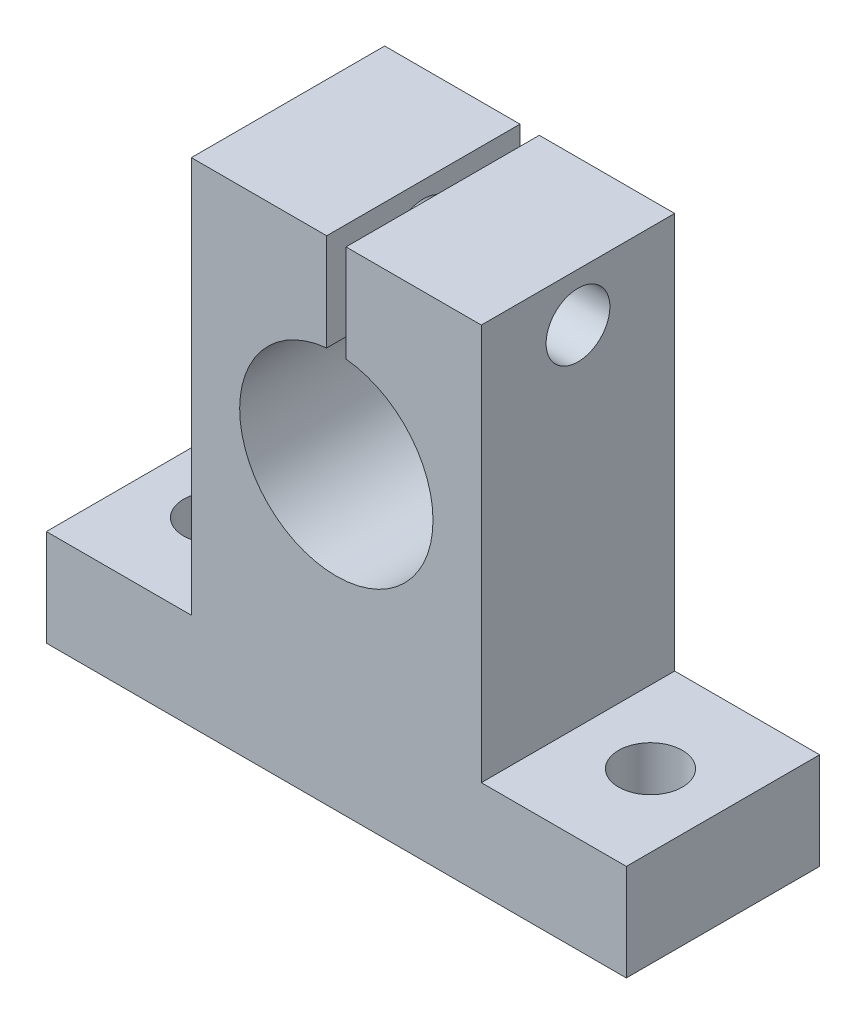
ISO-10303-21;
HEADER;
FILE_DESCRIPTION(('STEP AP214'),'2;1');
FILE_NAME('part.step','',(''),(''),'','','');
FILE_SCHEMA(('AUTOMOTIVE_DESIGN { 1 0 10303 214 1 1 1 1 }'));
ENDSEC;
DATA;
#1=APPLICATION_CONTEXT('core data for automotive mechanical design processes');
#2=APPLICATION_PROTOCOL_DEFINITION('international standard','automotive_design',2000,#1);
#3=PRODUCT_CONTEXT('',#1,'mechanical');
#4=PRODUCT('Part','Part','',(#3));
#5=PRODUCT_RELATED_PRODUCT_CATEGORY('part','',(#4));
#6=PRODUCT_DEFINITION_FORMATION('','',#4);
#7=PRODUCT_DEFINITION_CONTEXT('part definition',#1,'design');
#8=PRODUCT_DEFINITION('design','',#6,#7);
#9=PRODUCT_DEFINITION_SHAPE('','',#8);
#10=(LENGTH_UNIT() NAMED_UNIT(*) SI_UNIT(.MILLI.,.METRE.));
#11=(NAMED_UNIT(*) PLANE_ANGLE_UNIT() SI_UNIT($,.RADIAN.));
#12=(NAMED_UNIT(*) SI_UNIT($,.STERADIAN.) SOLID_ANGLE_UNIT());
#13=UNCERTAINTY_MEASURE_WITH_UNIT(LENGTH_MEASURE(1.E-05),#10,'distance_accuracy_value','');
#14=(GEOMETRIC_REPRESENTATION_CONTEXT(3) GLOBAL_UNCERTAINTY_ASSIGNED_CONTEXT((#13)) GLOBAL_UNIT_ASSIGNED_CONTEXT((#10,
#11,#12)) REPRESENTATION_CONTEXT('',''));
#15=CARTESIAN_POINT('',(0.,0.,0.));
#16=DIRECTION('',(0.,0.,1.));
#17=DIRECTION('',(1.,0.,0.));
#18=AXIS2_PLACEMENT_3D('',#15,#16,#17);
#19=CARTESIAN_POINT('',(15.,51.,10.));
#20=DIRECTION('',(0.,-1.,0.));
#21=DIRECTION('',(0.,0.,-1.));
#22=AXIS2_PLACEMENT_3D('',#19,#20,#21);
#23=PLANE('',#22);
#24=DIRECTION('',(-1.,0.,0.));
#25=VECTOR('',#24,1.);
#26=CARTESIAN_POINT('',(15.,51.,-10.));
#27=LINE('',#26,#25);
#28=CARTESIAN_POINT('',(45.,51.,-10.));
#29=VERTEX_POINT('',#28);
#30=CARTESIAN_POINT('',(31.,51.,-10.));
#31=VERTEX_POINT('',#30);
#32=EDGE_CURVE('E136',#29,#31,#27,.T.);
#33=ORIENTED_EDGE('',*,*,#32,.T.);
#34=DIRECTION('',(0.,0.,-1.));
#35=VECTOR('',#34,1.);
#36=CARTESIAN_POINT('',(31.,51.,10.));
#37=LINE('',#36,#35);
#38=CARTESIAN_POINT('',(31.,51.,10.));
#39=VERTEX_POINT('',#38);
#40=EDGE_CURVE('E121',#39,#31,#37,.T.);
#41=ORIENTED_EDGE('',*,*,#40,.F.);
#42=DIRECTION('',(-1.,0.,0.));
#43=VECTOR('',#42,1.);
#44=CARTESIAN_POINT('',(15.,51.,10.));
#45=LINE('',#44,#43);
#46=CARTESIAN_POINT('',(45.,51.,10.));
#47=VERTEX_POINT('',#46);
#48=EDGE_CURVE('E221',#47,#39,#45,.T.);
#49=ORIENTED_EDGE('',*,*,#48,.F.);
#50=DIRECTION('',(0.,0.,-1.));
#51=VECTOR('',#50,1.);
#52=CARTESIAN_POINT('',(45.,51.,10.));
#53=LINE('',#52,#51);
#54=EDGE_CURVE('E144',#47,#29,#53,.T.);
#55=ORIENTED_EDGE('',*,*,#54,.T.);
#56=EDGE_LOOP('',(#33,#41,#49,#55));
#57=FACE_BOUND('',#56,.T.);
#58=ADVANCED_FACE('F32',(#57),#23,.F.);
#59=CARTESIAN_POINT('',(61.,46.,0.));
#60=DIRECTION('',(-1.,0.,0.));
#61=DIRECTION('',(0.,0.,1.));
#62=AXIS2_PLACEMENT_3D('',#59,#60,#61);
#63=CYLINDRICAL_SURFACE('',#62,3.3);
#64=CARTESIAN_POINT('',(31.,46.,0.));
#65=DIRECTION('',(1.,0.,0.));
#66=DIRECTION('',(0.,0.,-1.));
#67=AXIS2_PLACEMENT_3D('',#64,#65,#66);
#68=CIRCLE('',#67,3.3);
#69=CARTESIAN_POINT('',(31.,46.,-3.3));
#70=VERTEX_POINT('',#69);
#71=EDGE_CURVE('E36',#70,#70,#68,.F.);
#72=ORIENTED_EDGE('',*,*,#71,.T.);
#73=EDGE_LOOP('',(#72));
#74=FACE_BOUND('',#73,.T.);
#75=CARTESIAN_POINT('',(45.,46.,0.));
#76=DIRECTION('',(-1.,0.,0.));
#77=DIRECTION('',(0.,0.,1.));
#78=AXIS2_PLACEMENT_3D('',#75,#76,#77);
#79=CIRCLE('',#78,3.3);
#80=CARTESIAN_POINT('',(45.,46.,3.3));
#81=VERTEX_POINT('',#80);
#82=EDGE_CURVE('E193',#81,#81,#79,.T.);
#83=ORIENTED_EDGE('',*,*,#82,.F.);
#84=EDGE_LOOP('',(#83));
#85=FACE_BOUND('',#84,.T.);
#86=ADVANCED_FACE('F286',(#74,#85),#63,.F.);
#87=CARTESIAN_POINT('',(0.,0.,10.));
#88=DIRECTION('',(1.,0.,0.));
#89=DIRECTION('',(0.,0.,-1.));
#90=AXIS2_PLACEMENT_3D('',#87,#88,#89);
#91=PLANE('',#90);
#92=DIRECTION('',(0.,-1.,0.));
#93=VECTOR('',#92,1.);
#94=CARTESIAN_POINT('',(0.,0.,-10.));
#95=LINE('',#94,#93);
#96=CARTESIAN_POINT('',(0.,10.,-10.));
#97=VERTEX_POINT('',#96);
#98=CARTESIAN_POINT('',(0.,0.,-10.));
#99=VERTEX_POINT('',#98);
#100=EDGE_CURVE('E175',#97,#99,#95,.T.);
#101=ORIENTED_EDGE('',*,*,#100,.T.);
#102=DIRECTION('',(0.,0.,-1.));
#103=VECTOR('',#102,1.);
#104=CARTESIAN_POINT('',(0.,0.,10.));
#105=LINE('',#104,#103);
#106=CARTESIAN_POINT('',(0.,0.,10.));
#107=VERTEX_POINT('',#106);
#108=EDGE_CURVE('E11',#107,#99,#105,.T.);
#109=ORIENTED_EDGE('',*,*,#108,.F.);
#110=DIRECTION('',(0.,-1.,0.));
#111=VECTOR('',#110,1.);
#112=CARTESIAN_POINT('',(0.,0.,10.));
#113=LINE('',#112,#111);
#114=CARTESIAN_POINT('',(0.,10.,10.));
#115=VERTEX_POINT('',#114);
#116=EDGE_CURVE('E155',#115,#107,#113,.T.);
#117=ORIENTED_EDGE('',*,*,#116,.F.);
#118=DIRECTION('',(0.,0.,-1.));
#119=VECTOR('',#118,1.);
#120=CARTESIAN_POINT('',(0.,10.,10.));
#121=LINE('',#120,#119);
#122=EDGE_CURVE('E156',#115,#97,#121,.T.);
#123=ORIENTED_EDGE('',*,*,#122,.T.);
#124=EDGE_LOOP('',(#101,#109,#117,#123));
#125=FACE_BOUND('',#124,.T.);
#126=ADVANCED_FACE('F34',(#125),#91,.F.);
#127=CARTESIAN_POINT('',(0.,0.,10.));
#128=DIRECTION('',(0.,1.,0.));
#129=DIRECTION('',(0.,0.,1.));
#130=AXIS2_PLACEMENT_3D('',#127,#128,#129);
#131=PLANE('',#130);
#132=CARTESIAN_POINT('',(52.5,0.,0.));
#133=DIRECTION('',(0.,1.,0.));
#134=DIRECTION('',(0.,0.,1.));
#135=AXIS2_PLACEMENT_3D('',#132,#133,#134);
#136=CIRCLE('',#135,3.3);
#137=CARTESIAN_POINT('',(52.5,0.,3.3));
#138=VERTEX_POINT('',#137);
#139=EDGE_CURVE('E199',#138,#138,#136,.T.);
#140=ORIENTED_EDGE('',*,*,#139,.T.);
#141=EDGE_LOOP('',(#140));
#142=FACE_BOUND('',#141,.T.);
#143=CARTESIAN_POINT('',(7.5,0.,0.));
#144=DIRECTION('',(0.,1.,0.));
#145=DIRECTION('',(0.,0.,1.));
#146=AXIS2_PLACEMENT_3D('',#143,#144,#145);
#147=CIRCLE('',#146,3.3);
#148=CARTESIAN_POINT('',(7.5,0.,3.3));
#149=VERTEX_POINT('',#148);
#150=EDGE_CURVE('E205',#149,#149,#147,.T.);
#151=ORIENTED_EDGE('',*,*,#150,.T.);
#152=EDGE_LOOP('',(#151));
#153=FACE_BOUND('',#152,.T.);
#154=DIRECTION('',(1.,0.,0.));
#155=VECTOR('',#154,1.);
#156=CARTESIAN_POINT('',(0.,0.,-10.));
#157=LINE('',#156,#155);
#158=CARTESIAN_POINT('',(60.,0.,-10.));
#159=VERTEX_POINT('',#158);
#160=EDGE_CURVE('E228',#99,#159,#157,.T.);
#161=ORIENTED_EDGE('',*,*,#160,.T.);
#162=DIRECTION('',(0.,0.,-1.));
#163=VECTOR('',#162,1.);
#164=CARTESIAN_POINT('',(60.,0.,10.));
#165=LINE('',#164,#163);
#166=CARTESIAN_POINT('',(60.,0.,10.));
#167=VERTEX_POINT('',#166);
#168=EDGE_CURVE('E41',#167,#159,#165,.T.);
#169=ORIENTED_EDGE('',*,*,#168,.F.);
#170=DIRECTION('',(1.,0.,0.));
#171=VECTOR('',#170,1.);
#172=CARTESIAN_POINT('',(0.,0.,10.));
#173=LINE('',#172,#171);
#174=EDGE_CURVE('E212',#107,#167,#173,.T.);
#175=ORIENTED_EDGE('',*,*,#174,.F.);
#176=ORIENTED_EDGE('',*,*,#108,.T.);
#177=EDGE_LOOP('',(#161,#169,#175,#176));
#178=FACE_BOUND('',#177,.T.);
#179=ADVANCED_FACE('F252',(#142,#153,#178),#131,.F.);
#180=CARTESIAN_POINT('',(60.,0.,10.));
#181=DIRECTION('',(-1.,0.,0.));
#182=DIRECTION('',(0.,0.,1.));
#183=AXIS2_PLACEMENT_3D('',#180,#181,#182);
#184=PLANE('',#183);
#185=DIRECTION('',(0.,1.,0.));
#186=VECTOR('',#185,1.);
#187=CARTESIAN_POINT('',(60.,0.,-10.));
#188=LINE('',#187,#186);
#189=CARTESIAN_POINT('',(60.,10.,-10.));
#190=VERTEX_POINT('',#189);
#191=EDGE_CURVE('E230',#159,#190,#188,.T.);
#192=ORIENTED_EDGE('',*,*,#191,.T.);
#193=DIRECTION('',(0.,0.,-1.));
#194=VECTOR('',#193,1.);
#195=CARTESIAN_POINT('',(60.,10.,10.));
#196=LINE('',#195,#194);
#197=CARTESIAN_POINT('',(60.,10.,10.));
#198=VERTEX_POINT('',#197);
#199=EDGE_CURVE('E170',#198,#190,#196,.T.);
#200=ORIENTED_EDGE('',*,*,#199,.F.);
#201=DIRECTION('',(0.,1.,0.));
#202=VECTOR('',#201,1.);
#203=CARTESIAN_POINT('',(60.,0.,10.));
#204=LINE('',#203,#202);
#205=EDGE_CURVE('E214',#167,#198,#204,.T.);
#206=ORIENTED_EDGE('',*,*,#205,.F.);
#207=ORIENTED_EDGE('',*,*,#168,.T.);
#208=EDGE_LOOP('',(#192,#200,#206,#207));
#209=FACE_BOUND('',#208,.T.);
#210=ADVANCED_FACE('F242',(#209),#184,.F.);
#211=CARTESIAN_POINT('',(45.,10.,10.));
#212=DIRECTION('',(0.,-1.,0.));
#213=DIRECTION('',(0.,0.,-1.));
#214=AXIS2_PLACEMENT_3D('',#211,#212,#213);
#215=PLANE('',#214);
#216=CARTESIAN_POINT('',(52.5,10.,0.));
#217=DIRECTION('',(0.,1.,0.));
#218=DIRECTION('',(0.,0.,1.));
#219=AXIS2_PLACEMENT_3D('',#216,#217,#218);
#220=CIRCLE('',#219,3.3);
#221=CARTESIAN_POINT('',(52.5,10.,3.3));
#222=VERTEX_POINT('',#221);
#223=EDGE_CURVE('E196',#222,#222,#220,.T.);
#224=ORIENTED_EDGE('',*,*,#223,.F.);
#225=EDGE_LOOP('',(#224));
#226=FACE_BOUND('',#225,.T.);
#227=DIRECTION('',(-1.,0.,0.));
#228=VECTOR('',#227,1.);
#229=CARTESIAN_POINT('',(45.,10.,-10.));
#230=LINE('',#229,#228);
#231=CARTESIAN_POINT('',(45.,10.,-10.));
#232=VERTEX_POINT('',#231);
#233=EDGE_CURVE('E231',#190,#232,#230,.T.);
#234=ORIENTED_EDGE('',*,*,#233,.T.);
#235=DIRECTION('',(0.,0.,-1.));
#236=VECTOR('',#235,1.);
#237=CARTESIAN_POINT('',(45.,10.,10.));
#238=LINE('',#237,#236);
#239=CARTESIAN_POINT('',(45.,10.,10.));
#240=VERTEX_POINT('',#239);
#241=EDGE_CURVE('E167',#240,#232,#238,.T.);
#242=ORIENTED_EDGE('',*,*,#241,.F.);
#243=DIRECTION('',(-1.,0.,0.));
#244=VECTOR('',#243,1.);
#245=CARTESIAN_POINT('',(45.,10.,10.));
#246=LINE('',#245,#244);
#247=EDGE_CURVE('E216',#198,#240,#246,.T.);
#248=ORIENTED_EDGE('',*,*,#247,.F.);
#249=ORIENTED_EDGE('',*,*,#199,.T.);
#250=EDGE_LOOP('',(#234,#242,#248,#249));
#251=FACE_BOUND('',#250,.T.);
#252=ADVANCED_FACE('F246',(#226,#251),#215,.F.);
#253=CARTESIAN_POINT('',(45.,10.,10.));
#254=DIRECTION('',(-1.,0.,0.));
#255=DIRECTION('',(0.,0.,1.));
#256=AXIS2_PLACEMENT_3D('',#253,#254,#255);
#257=PLANE('',#256);
#258=ORIENTED_EDGE('',*,*,#82,.T.);
#259=EDGE_LOOP('',(#258));
#260=FACE_BOUND('',#259,.T.);
#261=DIRECTION('',(0.,1.,0.));
#262=VECTOR('',#261,1.);
#263=CARTESIAN_POINT('',(45.,10.,-10.));
#264=LINE('',#263,#262);
#265=EDGE_CURVE('E150',#232,#29,#264,.T.);
#266=ORIENTED_EDGE('',*,*,#265,.T.);
#267=ORIENTED_EDGE('',*,*,#54,.F.);
#268=DIRECTION('',(0.,1.,0.));
#269=VECTOR('',#268,1.);
#270=CARTESIAN_POINT('',(45.,10.,10.));
#271=LINE('',#270,#269);
#272=EDGE_CURVE('E218',#240,#47,#271,.T.);
#273=ORIENTED_EDGE('',*,*,#272,.F.);
#274=ORIENTED_EDGE('',*,*,#241,.T.);
#275=EDGE_LOOP('',(#266,#267,#273,#274));
#276=FACE_BOUND('',#275,.T.);
#277=ADVANCED_FACE('F236',(#260,#276),#257,.F.);
#278=CARTESIAN_POINT('',(29.,51.,10.));
#279=VERTEX_POINT('',#278);
#280=CARTESIAN_POINT('',(15.,51.,10.));
#281=VERTEX_POINT('',#280);
#282=EDGE_CURVE('E220',#279,#281,#45,.T.);
#283=ORIENTED_EDGE('',*,*,#282,.F.);
#284=DIRECTION('',(0.,0.,1.));
#285=VECTOR('',#284,1.);
#286=CARTESIAN_POINT('',(29.,51.,10.));
#287=LINE('',#286,#285);
#288=CARTESIAN_POINT('',(29.,51.,-10.));
#289=VERTEX_POINT('',#288);
#290=EDGE_CURVE('E129',#289,#279,#287,.T.);
#291=ORIENTED_EDGE('',*,*,#290,.F.);
#292=CARTESIAN_POINT('',(15.,51.,-10.));
#293=VERTEX_POINT('',#292);
#294=EDGE_CURVE('E146',#289,#293,#27,.T.);
#295=ORIENTED_EDGE('',*,*,#294,.T.);
#296=DIRECTION('',(0.,0.,-1.));
#297=VECTOR('',#296,1.);
#298=CARTESIAN_POINT('',(15.,51.,10.));
#299=LINE('',#298,#297);
#300=EDGE_CURVE('E163',#281,#293,#299,.T.);
#301=ORIENTED_EDGE('',*,*,#300,.F.);
#302=EDGE_LOOP('',(#283,#291,#295,#301));
#303=FACE_BOUND('',#302,.T.);
#304=ADVANCED_FACE('F268',(#303),#23,.F.);
#305=CARTESIAN_POINT('',(15.,10.,10.));
#306=DIRECTION('',(1.,0.,0.));
#307=DIRECTION('',(0.,0.,-1.));
#308=AXIS2_PLACEMENT_3D('',#305,#306,#307);
#309=PLANE('',#308);
#310=CARTESIAN_POINT('',(15.,46.,0.));
#311=DIRECTION('',(-1.,0.,0.));
#312=DIRECTION('',(0.,0.,1.));
#313=AXIS2_PLACEMENT_3D('',#310,#311,#312);
#314=CIRCLE('',#313,3.3);
#315=CARTESIAN_POINT('',(15.,46.,3.3));
#316=VERTEX_POINT('',#315);
#317=EDGE_CURVE('E190',#316,#316,#314,.T.);
#318=ORIENTED_EDGE('',*,*,#317,.F.);
#319=EDGE_LOOP('',(#318));
#320=FACE_BOUND('',#319,.T.);
#321=DIRECTION('',(0.,-1.,0.));
#322=VECTOR('',#321,1.);
#323=CARTESIAN_POINT('',(15.,10.,-10.));
#324=LINE('',#323,#322);
#325=CARTESIAN_POINT('',(15.,10.,-10.));
#326=VERTEX_POINT('',#325);
#327=EDGE_CURVE('E145',#293,#326,#324,.T.);
#328=ORIENTED_EDGE('',*,*,#327,.T.);
#329=DIRECTION('',(0.,0.,-1.));
#330=VECTOR('',#329,1.);
#331=CARTESIAN_POINT('',(15.,10.,10.));
#332=LINE('',#331,#330);
#333=CARTESIAN_POINT('',(15.,10.,10.));
#334=VERTEX_POINT('',#333);
#335=EDGE_CURVE('E159',#334,#326,#332,.T.);
#336=ORIENTED_EDGE('',*,*,#335,.F.);
#337=DIRECTION('',(0.,-1.,0.));
#338=VECTOR('',#337,1.);
#339=CARTESIAN_POINT('',(15.,10.,10.));
#340=LINE('',#339,#338);
#341=EDGE_CURVE('E223',#281,#334,#340,.T.);
#342=ORIENTED_EDGE('',*,*,#341,.F.);
#343=ORIENTED_EDGE('',*,*,#300,.T.);
#344=EDGE_LOOP('',(#328,#336,#342,#343));
#345=FACE_BOUND('',#344,.T.);
#346=ADVANCED_FACE('F264',(#320,#345),#309,.F.);
#347=CARTESIAN_POINT('',(0.,10.,10.));
#348=DIRECTION('',(0.,-1.,0.));
#349=DIRECTION('',(0.,0.,-1.));
#350=AXIS2_PLACEMENT_3D('',#347,#348,#349);
#351=PLANE('',#350);
#352=CARTESIAN_POINT('',(7.5,10.,0.));
#353=DIRECTION('',(0.,1.,0.));
#354=DIRECTION('',(0.,0.,1.));
#355=AXIS2_PLACEMENT_3D('',#352,#353,#354);
#356=CIRCLE('',#355,3.3);
#357=CARTESIAN_POINT('',(7.5,10.,3.3));
#358=VERTEX_POINT('',#357);
#359=EDGE_CURVE('E202',#358,#358,#356,.T.);
#360=ORIENTED_EDGE('',*,*,#359,.F.);
#361=EDGE_LOOP('',(#360));
#362=FACE_BOUND('',#361,.T.);
#363=DIRECTION('',(-1.,0.,0.));
#364=VECTOR('',#363,1.);
#365=CARTESIAN_POINT('',(0.,10.,-10.));
#366=LINE('',#365,#364);
#367=EDGE_CURVE('E148',#326,#97,#366,.T.);
#368=ORIENTED_EDGE('',*,*,#367,.T.);
#369=ORIENTED_EDGE('',*,*,#122,.F.);
#370=DIRECTION('',(-1.,0.,0.));
#371=VECTOR('',#370,1.);
#372=CARTESIAN_POINT('',(0.,10.,10.));
#373=LINE('',#372,#371);
#374=EDGE_CURVE('E160',#334,#115,#373,.T.);
#375=ORIENTED_EDGE('',*,*,#374,.F.);
#376=ORIENTED_EDGE('',*,*,#335,.T.);
#377=EDGE_LOOP('',(#368,#369,#375,#376));
#378=FACE_BOUND('',#377,.T.);
#379=ADVANCED_FACE('F259',(#362,#378),#351,.F.);
#380=CARTESIAN_POINT('',(0.,0.,10.));
#381=DIRECTION('',(0.,0.,-1.));
#382=DIRECTION('',(-1.,0.,0.));
#383=AXIS2_PLACEMENT_3D('',#380,#381,#382);
#384=PLANE('',#383);
#385=ORIENTED_EDGE('',*,*,#48,.T.);
#386=DIRECTION('',(0.,1.,0.));
#387=VECTOR('',#386,1.);
#388=CARTESIAN_POINT('',(31.,36.,10.));
#389=LINE('',#388,#387);
#390=CARTESIAN_POINT('',(31.,40.9498743710662,10.));
#391=VERTEX_POINT('',#390);
#392=EDGE_CURVE('E124',#391,#39,#389,.T.);
#393=ORIENTED_EDGE('',*,*,#392,.F.);
#394=CARTESIAN_POINT('',(30.,31.,10.));
#395=DIRECTION('',(0.,0.,1.));
#396=DIRECTION('',(1.,0.,0.));
#397=AXIS2_PLACEMENT_3D('',#394,#395,#396);
#398=CIRCLE('',#397,10.);
#399=CARTESIAN_POINT('',(29.,40.9498743710662,10.));
#400=VERTEX_POINT('',#399);
#401=EDGE_CURVE('E176',#400,#391,#398,.T.);
#402=ORIENTED_EDGE('',*,*,#401,.F.);
#403=DIRECTION('',(0.,1.,0.));
#404=VECTOR('',#403,1.);
#405=CARTESIAN_POINT('',(29.,36.,10.));
#406=LINE('',#405,#404);
#407=EDGE_CURVE('E49',#400,#279,#406,.T.);
#408=ORIENTED_EDGE('',*,*,#407,.T.);
#409=ORIENTED_EDGE('',*,*,#282,.T.);
#410=ORIENTED_EDGE('',*,*,#341,.T.);
#411=ORIENTED_EDGE('',*,*,#374,.T.);
#412=ORIENTED_EDGE('',*,*,#116,.T.);
#413=ORIENTED_EDGE('',*,*,#174,.T.);
#414=ORIENTED_EDGE('',*,*,#205,.T.);
#415=ORIENTED_EDGE('',*,*,#247,.T.);
#416=ORIENTED_EDGE('',*,*,#272,.T.);
#417=EDGE_LOOP('',(#385,#393,#402,#408,#409,#410,#411,#412,#413,#414,#415,#416));
#418=FACE_BOUND('',#417,.T.);
#419=ADVANCED_FACE('F248',(#418),#384,.F.);
#420=CARTESIAN_POINT('',(0.,0.,-10.));
#421=DIRECTION('',(0.,0.,-1.));
#422=DIRECTION('',(-1.,0.,0.));
#423=AXIS2_PLACEMENT_3D('',#420,#421,#422);
#424=PLANE('',#423);
#425=DIRECTION('',(0.,1.,0.));
#426=VECTOR('',#425,1.);
#427=CARTESIAN_POINT('',(31.,36.,-10.));
#428=LINE('',#427,#426);
#429=CARTESIAN_POINT('',(31.,40.9498743710662,-10.));
#430=VERTEX_POINT('',#429);
#431=EDGE_CURVE('E57',#430,#31,#428,.T.);
#432=ORIENTED_EDGE('',*,*,#431,.T.);
#433=ORIENTED_EDGE('',*,*,#32,.F.);
#434=ORIENTED_EDGE('',*,*,#265,.F.);
#435=ORIENTED_EDGE('',*,*,#233,.F.);
#436=ORIENTED_EDGE('',*,*,#191,.F.);
#437=ORIENTED_EDGE('',*,*,#160,.F.);
#438=ORIENTED_EDGE('',*,*,#100,.F.);
#439=ORIENTED_EDGE('',*,*,#367,.F.);
#440=ORIENTED_EDGE('',*,*,#327,.F.);
#441=ORIENTED_EDGE('',*,*,#294,.F.);
#442=DIRECTION('',(0.,1.,0.));
#443=VECTOR('',#442,1.);
#444=CARTESIAN_POINT('',(29.,36.,-10.));
#445=LINE('',#444,#443);
#446=CARTESIAN_POINT('',(29.,40.9498743710662,-10.));
#447=VERTEX_POINT('',#446);
#448=EDGE_CURVE('E140',#447,#289,#445,.T.);
#449=ORIENTED_EDGE('',*,*,#448,.F.);
#450=CARTESIAN_POINT('',(30.,31.,-10.));
#451=DIRECTION('',(0.,0.,-1.));
#452=DIRECTION('',(-1.,0.,0.));
#453=AXIS2_PLACEMENT_3D('',#450,#451,#452);
#454=CIRCLE('',#453,10.);
#455=EDGE_CURVE('E139',#430,#447,#454,.T.);
#456=ORIENTED_EDGE('',*,*,#455,.F.);
#457=EDGE_LOOP('',(#432,#433,#434,#435,#436,#437,#438,#439,#440,#441,#449,#456));
#458=FACE_BOUND('',#457,.T.);
#459=ADVANCED_FACE('F134',(#458),#424,.T.);
#460=CARTESIAN_POINT('',(30.,31.,-16.));
#461=DIRECTION('',(0.,0.,1.));
#462=DIRECTION('',(1.,0.,0.));
#463=AXIS2_PLACEMENT_3D('',#460,#461,#462);
#464=CYLINDRICAL_SURFACE('',#463,10.);
#465=ORIENTED_EDGE('',*,*,#401,.T.);
#466=DIRECTION('',(0.,0.,1.));
#467=VECTOR('',#466,1.);
#468=CARTESIAN_POINT('',(31.,40.9498743710662,-16.));
#469=LINE('',#468,#467);
#470=EDGE_CURVE('E188',#391,#430,#469,.F.);
#471=ORIENTED_EDGE('',*,*,#470,.T.);
#472=ORIENTED_EDGE('',*,*,#455,.T.);
#473=DIRECTION('',(0.,0.,1.));
#474=VECTOR('',#473,1.);
#475=CARTESIAN_POINT('',(29.,40.9498743710662,-16.));
#476=LINE('',#475,#474);
#477=EDGE_CURVE('E179',#447,#400,#476,.T.);
#478=ORIENTED_EDGE('',*,*,#477,.T.);
#479=EDGE_LOOP('',(#465,#471,#472,#478));
#480=FACE_BOUND('',#479,.T.);
#481=ADVANCED_FACE('F271',(#480),#464,.F.);
#482=CARTESIAN_POINT('',(7.5,-16.,0.));
#483=DIRECTION('',(0.,1.,0.));
#484=DIRECTION('',(0.,0.,1.));
#485=AXIS2_PLACEMENT_3D('',#482,#483,#484);
#486=CYLINDRICAL_SURFACE('',#485,3.3);
#487=ORIENTED_EDGE('',*,*,#359,.T.);
#488=EDGE_LOOP('',(#487));
#489=FACE_BOUND('',#488,.T.);
#490=ORIENTED_EDGE('',*,*,#150,.F.);
#491=EDGE_LOOP('',(#490));
#492=FACE_BOUND('',#491,.T.);
#493=ADVANCED_FACE('F318',(#489,#492),#486,.F.);
#494=CARTESIAN_POINT('',(52.5,-16.,0.));
#495=DIRECTION('',(0.,1.,0.));
#496=DIRECTION('',(0.,0.,1.));
#497=AXIS2_PLACEMENT_3D('',#494,#495,#496);
#498=CYLINDRICAL_SURFACE('',#497,3.3);
#499=ORIENTED_EDGE('',*,*,#223,.T.);
#500=EDGE_LOOP('',(#499));
#501=FACE_BOUND('',#500,.T.);
#502=ORIENTED_EDGE('',*,*,#139,.F.);
#503=EDGE_LOOP('',(#502));
#504=FACE_BOUND('',#503,.T.);
#505=ADVANCED_FACE('F284',(#501,#504),#498,.F.);
#506=CARTESIAN_POINT('',(29.,46.,0.));
#507=DIRECTION('',(-1.,0.,0.));
#508=DIRECTION('',(0.,0.,1.));
#509=AXIS2_PLACEMENT_3D('',#506,#507,#508);
#510=CIRCLE('',#509,3.3);
#511=CARTESIAN_POINT('',(29.,46.,3.3));
#512=VERTEX_POINT('',#511);
#513=EDGE_CURVE('E177',#512,#512,#510,.F.);
#514=ORIENTED_EDGE('',*,*,#513,.T.);
#515=EDGE_LOOP('',(#514));
#516=FACE_BOUND('',#515,.T.);
#517=ORIENTED_EDGE('',*,*,#317,.T.);
#518=EDGE_LOOP('',(#517));
#519=FACE_BOUND('',#518,.T.);
#520=ADVANCED_FACE('F275',(#516,#519),#63,.F.);
#521=CARTESIAN_POINT('',(29.,36.,10.));
#522=DIRECTION('',(-1.,0.,0.));
#523=DIRECTION('',(0.,0.,1.));
#524=AXIS2_PLACEMENT_3D('',#521,#522,#523);
#525=PLANE('',#524);
#526=ORIENTED_EDGE('',*,*,#513,.F.);
#527=EDGE_LOOP('',(#526));
#528=FACE_BOUND('',#527,.T.);
#529=ORIENTED_EDGE('',*,*,#448,.T.);
#530=ORIENTED_EDGE('',*,*,#290,.T.);
#531=ORIENTED_EDGE('',*,*,#407,.F.);
#532=ORIENTED_EDGE('',*,*,#477,.F.);
#533=EDGE_LOOP('',(#529,#530,#531,#532));
#534=FACE_BOUND('',#533,.T.);
#535=ADVANCED_FACE('F273',(#528,#534),#525,.F.);
#536=CARTESIAN_POINT('',(31.,36.,10.));
#537=DIRECTION('',(1.,0.,0.));
#538=DIRECTION('',(0.,0.,-1.));
#539=AXIS2_PLACEMENT_3D('',#536,#537,#538);
#540=PLANE('',#539);
#541=ORIENTED_EDGE('',*,*,#71,.F.);
#542=EDGE_LOOP('',(#541));
#543=FACE_BOUND('',#542,.T.);
#544=ORIENTED_EDGE('',*,*,#392,.T.);
#545=ORIENTED_EDGE('',*,*,#40,.T.);
#546=ORIENTED_EDGE('',*,*,#431,.F.);
#547=ORIENTED_EDGE('',*,*,#470,.F.);
#548=EDGE_LOOP('',(#544,#545,#546,#547));
#549=FACE_BOUND('',#548,.T.);
#550=ADVANCED_FACE('F122',(#543,#549),#540,.F.);
#551=CLOSED_SHELL('',(#58,#86,#126,#179,#210,#252,#277,#304,#346,#379,#419,#459,#481,#493,#505,
#520,#535,#550));
#552=MANIFOLD_SOLID_BREP('B2',#551);
#553=ADVANCED_BREP_SHAPE_REPRESENTATION('',(#18,#552),#14);
#554=SHAPE_DEFINITION_REPRESENTATION(#9,#553);
ENDSEC;
END-ISO-10303-21;
